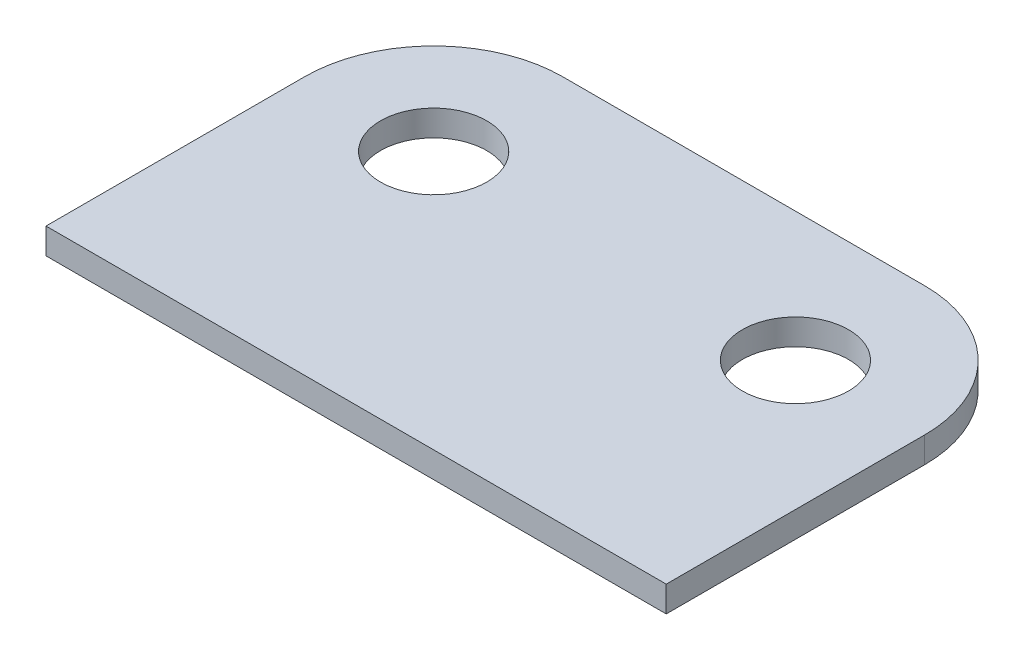
ISO-10303-21;
HEADER;
FILE_DESCRIPTION(('STEP AP214'),'2;1');
FILE_NAME('part.step','',(''),(''),'','','');
FILE_SCHEMA(('AUTOMOTIVE_DESIGN { 1 0 10303 214 1 1 1 1 }'));
ENDSEC;
DATA;
#1=APPLICATION_CONTEXT('core data for automotive mechanical design processes');
#2=APPLICATION_PROTOCOL_DEFINITION('international standard','automotive_design',2000,#1);
#3=PRODUCT_CONTEXT('',#1,'mechanical');
#4=PRODUCT('Part','Part','',(#3));
#5=PRODUCT_RELATED_PRODUCT_CATEGORY('part','',(#4));
#6=PRODUCT_DEFINITION_FORMATION('','',#4);
#7=PRODUCT_DEFINITION_CONTEXT('part definition',#1,'design');
#8=PRODUCT_DEFINITION('design','',#6,#7);
#9=PRODUCT_DEFINITION_SHAPE('','',#8);
#10=(LENGTH_UNIT() NAMED_UNIT(*) SI_UNIT(.MILLI.,.METRE.));
#11=(NAMED_UNIT(*) PLANE_ANGLE_UNIT() SI_UNIT($,.RADIAN.));
#12=(NAMED_UNIT(*) SI_UNIT($,.STERADIAN.) SOLID_ANGLE_UNIT());
#13=UNCERTAINTY_MEASURE_WITH_UNIT(LENGTH_MEASURE(1.E-05),#10,'distance_accuracy_value','');
#14=(GEOMETRIC_REPRESENTATION_CONTEXT(3) GLOBAL_UNCERTAINTY_ASSIGNED_CONTEXT((#13)) GLOBAL_UNIT_ASSIGNED_CONTEXT((#10,
#11,#12)) REPRESENTATION_CONTEXT('',''));
#15=CARTESIAN_POINT('',(0.,0.,0.));
#16=DIRECTION('',(0.,0.,1.));
#17=DIRECTION('',(1.,0.,0.));
#18=AXIS2_PLACEMENT_3D('',#15,#16,#17);
#19=CARTESIAN_POINT('',(11.1125,1.5875,-15.875));
#20=DIRECTION('',(0.,1.,0.));
#21=DIRECTION('',(0.,0.,1.));
#22=AXIS2_PLACEMENT_3D('',#19,#20,#21);
#23=PLANE('',#22);
#24=CARTESIAN_POINT('',(11.1125,1.5875,-15.875));
#25=DIRECTION('',(0.,1.,0.));
#26=DIRECTION('',(0.,0.,1.));
#27=AXIS2_PLACEMENT_3D('',#24,#25,#26);
#28=CIRCLE('',#27,3.2639);
#29=CARTESIAN_POINT('',(11.1125,1.5875,-12.6111));
#30=VERTEX_POINT('',#29);
#31=EDGE_CURVE('E128',#30,#30,#28,.T.);
#32=ORIENTED_EDGE('',*,*,#31,.F.);
#33=EDGE_LOOP('',(#32));
#34=FACE_BOUND('',#33,.T.);
#35=DIRECTION('',(0.,0.,-1.));
#36=VECTOR('',#35,1.);
#37=CARTESIAN_POINT('',(19.05,1.5875,0.));
#38=LINE('',#37,#36);
#39=CARTESIAN_POINT('',(19.05,1.5875,0.));
#40=VERTEX_POINT('',#39);
#41=CARTESIAN_POINT('',(19.05,1.5875,-15.875));
#42=VERTEX_POINT('',#41);
#43=EDGE_CURVE('E135',#40,#42,#38,.T.);
#44=ORIENTED_EDGE('',*,*,#43,.T.);
#45=CARTESIAN_POINT('',(11.1125,1.5875,-15.875));
#46=DIRECTION('',(0.,1.,0.));
#47=DIRECTION('',(0.,0.,1.));
#48=AXIS2_PLACEMENT_3D('',#45,#46,#47);
#49=CIRCLE('',#48,7.9375);
#50=CARTESIAN_POINT('',(11.1125,1.5875,-23.8125));
#51=VERTEX_POINT('',#50);
#52=EDGE_CURVE('E93',#42,#51,#49,.T.);
#53=ORIENTED_EDGE('',*,*,#52,.T.);
#54=DIRECTION('',(-1.,0.,0.));
#55=VECTOR('',#54,1.);
#56=CARTESIAN_POINT('',(-11.1125,1.5875,-23.8125));
#57=LINE('',#56,#55);
#58=CARTESIAN_POINT('',(-11.1125,1.5875,-23.8125));
#59=VERTEX_POINT('',#58);
#60=EDGE_CURVE('E106',#51,#59,#57,.T.);
#61=ORIENTED_EDGE('',*,*,#60,.T.);
#62=CARTESIAN_POINT('',(-11.1125,1.5875,-15.875));
#63=DIRECTION('',(0.,1.,0.));
#64=DIRECTION('',(0.,0.,1.));
#65=AXIS2_PLACEMENT_3D('',#62,#63,#64);
#66=CIRCLE('',#65,7.9375);
#67=CARTESIAN_POINT('',(-19.05,1.5875,-15.875));
#68=VERTEX_POINT('',#67);
#69=EDGE_CURVE('E100',#59,#68,#66,.T.);
#70=ORIENTED_EDGE('',*,*,#69,.T.);
#71=DIRECTION('',(0.,0.,1.));
#72=VECTOR('',#71,1.);
#73=CARTESIAN_POINT('',(-19.05,1.5875,-15.875));
#74=LINE('',#73,#72);
#75=CARTESIAN_POINT('',(-19.05,1.5875,0.));
#76=VERTEX_POINT('',#75);
#77=EDGE_CURVE('E104',#68,#76,#74,.T.);
#78=ORIENTED_EDGE('',*,*,#77,.T.);
#79=DIRECTION('',(1.,0.,0.));
#80=VECTOR('',#79,1.);
#81=CARTESIAN_POINT('',(-19.05,1.5875,0.));
#82=LINE('',#81,#80);
#83=EDGE_CURVE('E56',#76,#40,#82,.T.);
#84=ORIENTED_EDGE('',*,*,#83,.T.);
#85=EDGE_LOOP('',(#44,#53,#61,#70,#78,#84));
#86=FACE_BOUND('',#85,.T.);
#87=CARTESIAN_POINT('',(-11.1125,1.5875,-15.875));
#88=DIRECTION('',(0.,1.,0.));
#89=DIRECTION('',(0.,0.,1.));
#90=AXIS2_PLACEMENT_3D('',#87,#88,#89);
#91=CIRCLE('',#90,3.2639);
#92=CARTESIAN_POINT('',(-11.1125,1.5875,-12.6111));
#93=VERTEX_POINT('',#92);
#94=EDGE_CURVE('E177',#93,#93,#91,.T.);
#95=ORIENTED_EDGE('',*,*,#94,.F.);
#96=EDGE_LOOP('',(#95));
#97=FACE_BOUND('',#96,.T.);
#98=ADVANCED_FACE('F39',(#34,#86,#97),#23,.T.);
#99=CARTESIAN_POINT('',(11.1125,0.,-15.875));
#100=DIRECTION('',(0.,1.,0.));
#101=DIRECTION('',(0.,0.,1.));
#102=AXIS2_PLACEMENT_3D('',#99,#100,#101);
#103=PLANE('',#102);
#104=DIRECTION('',(0.,0.,-1.));
#105=VECTOR('',#104,1.);
#106=CARTESIAN_POINT('',(19.05,0.,0.));
#107=LINE('',#106,#105);
#108=CARTESIAN_POINT('',(19.05,0.,0.));
#109=VERTEX_POINT('',#108);
#110=CARTESIAN_POINT('',(19.05,0.,-15.875));
#111=VERTEX_POINT('',#110);
#112=EDGE_CURVE('E124',#109,#111,#107,.T.);
#113=ORIENTED_EDGE('',*,*,#112,.F.);
#114=DIRECTION('',(1.,0.,0.));
#115=VECTOR('',#114,1.);
#116=CARTESIAN_POINT('',(-19.05,0.,0.));
#117=LINE('',#116,#115);
#118=CARTESIAN_POINT('',(-19.05,0.,0.));
#119=VERTEX_POINT('',#118);
#120=EDGE_CURVE('E85',#119,#109,#117,.T.);
#121=ORIENTED_EDGE('',*,*,#120,.F.);
#122=DIRECTION('',(0.,0.,1.));
#123=VECTOR('',#122,1.);
#124=CARTESIAN_POINT('',(-19.05,0.,-15.875));
#125=LINE('',#124,#123);
#126=CARTESIAN_POINT('',(-19.05,0.,-15.875));
#127=VERTEX_POINT('',#126);
#128=EDGE_CURVE('E79',#127,#119,#125,.T.);
#129=ORIENTED_EDGE('',*,*,#128,.F.);
#130=CARTESIAN_POINT('',(-11.1125,0.,-15.875));
#131=DIRECTION('',(0.,1.,0.));
#132=DIRECTION('',(0.,0.,1.));
#133=AXIS2_PLACEMENT_3D('',#130,#131,#132);
#134=CIRCLE('',#133,7.9375);
#135=CARTESIAN_POINT('',(-11.1125,0.,-23.8125));
#136=VERTEX_POINT('',#135);
#137=EDGE_CURVE('E114',#136,#127,#134,.T.);
#138=ORIENTED_EDGE('',*,*,#137,.F.);
#139=DIRECTION('',(-1.,0.,0.));
#140=VECTOR('',#139,1.);
#141=CARTESIAN_POINT('',(-11.1125,0.,-23.8125));
#142=LINE('',#141,#140);
#143=CARTESIAN_POINT('',(11.1125,0.,-23.8125));
#144=VERTEX_POINT('',#143);
#145=EDGE_CURVE('E130',#144,#136,#142,.T.);
#146=ORIENTED_EDGE('',*,*,#145,.F.);
#147=CARTESIAN_POINT('',(11.1125,0.,-15.875));
#148=DIRECTION('',(0.,1.,0.));
#149=DIRECTION('',(0.,0.,1.));
#150=AXIS2_PLACEMENT_3D('',#147,#148,#149);
#151=CIRCLE('',#150,7.9375);
#152=EDGE_CURVE('E127',#111,#144,#151,.T.);
#153=ORIENTED_EDGE('',*,*,#152,.F.);
#154=EDGE_LOOP('',(#113,#121,#129,#138,#146,#153));
#155=FACE_BOUND('',#154,.T.);
#156=CARTESIAN_POINT('',(11.1125,0.,-15.875));
#157=DIRECTION('',(0.,1.,0.));
#158=DIRECTION('',(0.,0.,1.));
#159=AXIS2_PLACEMENT_3D('',#156,#157,#158);
#160=CIRCLE('',#159,3.2639);
#161=CARTESIAN_POINT('',(11.1125,0.,-12.6111));
#162=VERTEX_POINT('',#161);
#163=EDGE_CURVE('E183',#162,#162,#160,.T.);
#164=ORIENTED_EDGE('',*,*,#163,.T.);
#165=EDGE_LOOP('',(#164));
#166=FACE_BOUND('',#165,.T.);
#167=CARTESIAN_POINT('',(-11.1125,0.,-15.875));
#168=DIRECTION('',(0.,1.,0.));
#169=DIRECTION('',(0.,0.,1.));
#170=AXIS2_PLACEMENT_3D('',#167,#168,#169);
#171=CIRCLE('',#170,3.2639);
#172=CARTESIAN_POINT('',(-11.1125,0.,-12.6111));
#173=VERTEX_POINT('',#172);
#174=EDGE_CURVE('E180',#173,#173,#171,.T.);
#175=ORIENTED_EDGE('',*,*,#174,.T.);
#176=EDGE_LOOP('',(#175));
#177=FACE_BOUND('',#176,.T.);
#178=ADVANCED_FACE('F144',(#155,#166,#177),#103,.F.);
#179=CARTESIAN_POINT('',(19.05,1.5875,0.));
#180=DIRECTION('',(-1.,0.,0.));
#181=DIRECTION('',(0.,0.,1.));
#182=AXIS2_PLACEMENT_3D('',#179,#180,#181);
#183=PLANE('',#182);
#184=ORIENTED_EDGE('',*,*,#112,.T.);
#185=DIRECTION('',(0.,-1.,0.));
#186=VECTOR('',#185,1.);
#187=CARTESIAN_POINT('',(19.05,1.5875,-15.875));
#188=LINE('',#187,#186);
#189=EDGE_CURVE('E11',#42,#111,#188,.T.);
#190=ORIENTED_EDGE('',*,*,#189,.F.);
#191=ORIENTED_EDGE('',*,*,#43,.F.);
#192=DIRECTION('',(0.,-1.,0.));
#193=VECTOR('',#192,1.);
#194=CARTESIAN_POINT('',(19.05,1.5875,0.));
#195=LINE('',#194,#193);
#196=EDGE_CURVE('E120',#40,#109,#195,.T.);
#197=ORIENTED_EDGE('',*,*,#196,.T.);
#198=EDGE_LOOP('',(#184,#190,#191,#197));
#199=FACE_BOUND('',#198,.T.);
#200=ADVANCED_FACE('F41',(#199),#183,.F.);
#201=CARTESIAN_POINT('',(11.1125,1.5875,-15.875));
#202=DIRECTION('',(0.,-1.,0.));
#203=DIRECTION('',(0.,0.,-1.));
#204=AXIS2_PLACEMENT_3D('',#201,#202,#203);
#205=CYLINDRICAL_SURFACE('',#204,7.9375);
#206=ORIENTED_EDGE('',*,*,#152,.T.);
#207=DIRECTION('',(0.,-1.,0.));
#208=VECTOR('',#207,1.);
#209=CARTESIAN_POINT('',(11.1125,1.5875,-23.8125));
#210=LINE('',#209,#208);
#211=EDGE_CURVE('E48',#51,#144,#210,.T.);
#212=ORIENTED_EDGE('',*,*,#211,.F.);
#213=ORIENTED_EDGE('',*,*,#52,.F.);
#214=ORIENTED_EDGE('',*,*,#189,.T.);
#215=EDGE_LOOP('',(#206,#212,#213,#214));
#216=FACE_BOUND('',#215,.T.);
#217=ADVANCED_FACE('F226',(#216),#205,.T.);
#218=CARTESIAN_POINT('',(-11.1125,1.5875,-23.8125));
#219=DIRECTION('',(0.,0.,1.));
#220=DIRECTION('',(1.,0.,0.));
#221=AXIS2_PLACEMENT_3D('',#218,#219,#220);
#222=PLANE('',#221);
#223=ORIENTED_EDGE('',*,*,#145,.T.);
#224=DIRECTION('',(0.,-1.,0.));
#225=VECTOR('',#224,1.);
#226=CARTESIAN_POINT('',(-11.1125,1.5875,-23.8125));
#227=LINE('',#226,#225);
#228=EDGE_CURVE('E115',#59,#136,#227,.T.);
#229=ORIENTED_EDGE('',*,*,#228,.F.);
#230=ORIENTED_EDGE('',*,*,#60,.F.);
#231=ORIENTED_EDGE('',*,*,#211,.T.);
#232=EDGE_LOOP('',(#223,#229,#230,#231));
#233=FACE_BOUND('',#232,.T.);
#234=ADVANCED_FACE('F141',(#233),#222,.F.);
#235=CARTESIAN_POINT('',(-11.1125,1.5875,-15.875));
#236=DIRECTION('',(0.,-1.,0.));
#237=DIRECTION('',(0.,0.,-1.));
#238=AXIS2_PLACEMENT_3D('',#235,#236,#237);
#239=CYLINDRICAL_SURFACE('',#238,7.9375);
#240=ORIENTED_EDGE('',*,*,#137,.T.);
#241=DIRECTION('',(0.,-1.,0.));
#242=VECTOR('',#241,1.);
#243=CARTESIAN_POINT('',(-19.05,1.5875,-15.875));
#244=LINE('',#243,#242);
#245=EDGE_CURVE('E111',#68,#127,#244,.T.);
#246=ORIENTED_EDGE('',*,*,#245,.F.);
#247=ORIENTED_EDGE('',*,*,#69,.F.);
#248=ORIENTED_EDGE('',*,*,#228,.T.);
#249=EDGE_LOOP('',(#240,#246,#247,#248));
#250=FACE_BOUND('',#249,.T.);
#251=ADVANCED_FACE('F112',(#250),#239,.T.);
#252=CARTESIAN_POINT('',(-19.05,1.5875,-15.875));
#253=DIRECTION('',(1.,0.,0.));
#254=DIRECTION('',(0.,0.,-1.));
#255=AXIS2_PLACEMENT_3D('',#252,#253,#254);
#256=PLANE('',#255);
#257=ORIENTED_EDGE('',*,*,#128,.T.);
#258=DIRECTION('',(0.,-1.,0.));
#259=VECTOR('',#258,1.);
#260=CARTESIAN_POINT('',(-19.05,1.5875,0.));
#261=LINE('',#260,#259);
#262=EDGE_CURVE('E116',#76,#119,#261,.T.);
#263=ORIENTED_EDGE('',*,*,#262,.F.);
#264=ORIENTED_EDGE('',*,*,#77,.F.);
#265=ORIENTED_EDGE('',*,*,#245,.T.);
#266=EDGE_LOOP('',(#257,#263,#264,#265));
#267=FACE_BOUND('',#266,.T.);
#268=ADVANCED_FACE('F118',(#267),#256,.F.);
#269=CARTESIAN_POINT('',(-19.05,1.5875,0.));
#270=DIRECTION('',(0.,0.,-1.));
#271=DIRECTION('',(-1.,0.,0.));
#272=AXIS2_PLACEMENT_3D('',#269,#270,#271);
#273=PLANE('',#272);
#274=ORIENTED_EDGE('',*,*,#120,.T.);
#275=ORIENTED_EDGE('',*,*,#196,.F.);
#276=ORIENTED_EDGE('',*,*,#83,.F.);
#277=ORIENTED_EDGE('',*,*,#262,.T.);
#278=EDGE_LOOP('',(#274,#275,#276,#277));
#279=FACE_BOUND('',#278,.T.);
#280=ADVANCED_FACE('F149',(#279),#273,.F.);
#281=CARTESIAN_POINT('',(11.1125,1.5875,-15.875));
#282=DIRECTION('',(0.,-1.,0.));
#283=DIRECTION('',(0.,0.,-1.));
#284=AXIS2_PLACEMENT_3D('',#281,#282,#283);
#285=CYLINDRICAL_SURFACE('',#284,3.2639);
#286=ORIENTED_EDGE('',*,*,#31,.T.);
#287=EDGE_LOOP('',(#286));
#288=FACE_BOUND('',#287,.T.);
#289=ORIENTED_EDGE('',*,*,#163,.F.);
#290=EDGE_LOOP('',(#289));
#291=FACE_BOUND('',#290,.T.);
#292=ADVANCED_FACE('F151',(#288,#291),#285,.F.);
#293=CARTESIAN_POINT('',(-11.1125,1.5875,-15.875));
#294=DIRECTION('',(0.,-1.,0.));
#295=DIRECTION('',(0.,0.,-1.));
#296=AXIS2_PLACEMENT_3D('',#293,#294,#295);
#297=CYLINDRICAL_SURFACE('',#296,3.2639);
#298=ORIENTED_EDGE('',*,*,#94,.T.);
#299=EDGE_LOOP('',(#298));
#300=FACE_BOUND('',#299,.T.);
#301=ORIENTED_EDGE('',*,*,#174,.F.);
#302=EDGE_LOOP('',(#301));
#303=FACE_BOUND('',#302,.T.);
#304=ADVANCED_FACE('F157',(#300,#303),#297,.F.);
#305=CLOSED_SHELL('',(#98,#178,#200,#217,#234,#251,#268,#280,#292,#304));
#306=MANIFOLD_SOLID_BREP('B2',#305);
#307=ADVANCED_BREP_SHAPE_REPRESENTATION('',(#18,#306),#14);
#308=SHAPE_DEFINITION_REPRESENTATION(#9,#307);
ENDSEC;
END-ISO-10303-21;
